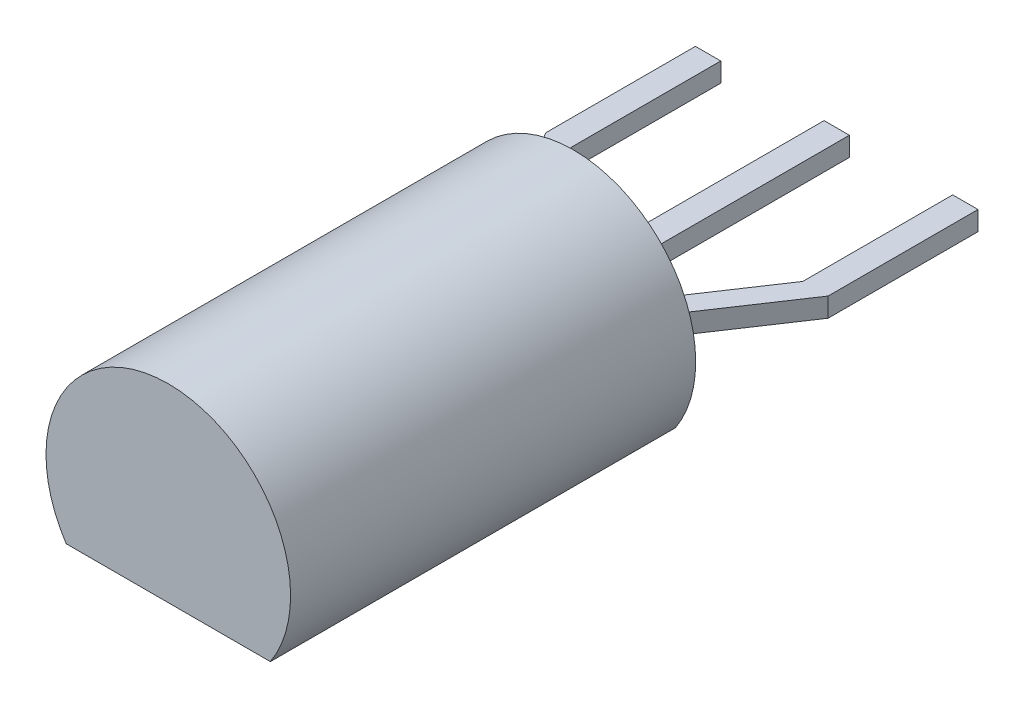
ISO-10303-21;
HEADER;
FILE_DESCRIPTION(('STEP AP214'),'2;1');
FILE_NAME('part.step','',(''),(''),'','','');
FILE_SCHEMA(('AUTOMOTIVE_DESIGN { 1 0 10303 214 1 1 1 1 }'));
ENDSEC;
DATA;
#1=APPLICATION_CONTEXT('core data for automotive mechanical design processes');
#2=APPLICATION_PROTOCOL_DEFINITION('international standard','automotive_design',2000,#1);
#3=PRODUCT_CONTEXT('',#1,'mechanical');
#4=PRODUCT('Part','Part','',(#3));
#5=PRODUCT_RELATED_PRODUCT_CATEGORY('part','',(#4));
#6=PRODUCT_DEFINITION_FORMATION('','',#4);
#7=PRODUCT_DEFINITION_CONTEXT('part definition',#1,'design');
#8=PRODUCT_DEFINITION('design','',#6,#7);
#9=PRODUCT_DEFINITION_SHAPE('','',#8);
#10=(LENGTH_UNIT() NAMED_UNIT(*) SI_UNIT(.MILLI.,.METRE.));
#11=(NAMED_UNIT(*) PLANE_ANGLE_UNIT() SI_UNIT($,.RADIAN.));
#12=(NAMED_UNIT(*) SI_UNIT($,.STERADIAN.) SOLID_ANGLE_UNIT());
#13=UNCERTAINTY_MEASURE_WITH_UNIT(LENGTH_MEASURE(1.E-05),#10,'distance_accuracy_value','');
#14=(GEOMETRIC_REPRESENTATION_CONTEXT(3) GLOBAL_UNCERTAINTY_ASSIGNED_CONTEXT((#13)) GLOBAL_UNIT_ASSIGNED_CONTEXT((#10,
#11,#12)) REPRESENTATION_CONTEXT('',''));
#15=CARTESIAN_POINT('',(0.,0.,0.));
#16=DIRECTION('',(0.,0.,1.));
#17=DIRECTION('',(1.,0.,0.));
#18=AXIS2_PLACEMENT_3D('',#15,#16,#17);
#19=CARTESIAN_POINT('',(0.25,0.19,0.26));
#20=DIRECTION('',(-0.831376502259989,0.,0.555709556773993));
#21=DIRECTION('',(0.,1.,0.));
#22=AXIS2_PLACEMENT_3D('',#19,#20,#21);
#23=PLANE('',#22);
#24=DIRECTION('',(0.555709556773993,0.,0.831376502259989));
#25=VECTOR('',#24,1.);
#26=CARTESIAN_POINT('',(0.25,0.19,0.26));
#27=LINE('',#26,#25);
#28=CARTESIAN_POINT('',(0.25,0.19,0.26));
#29=VERTEX_POINT('',#28);
#30=CARTESIAN_POINT('',(1.52,0.19,2.16));
#31=VERTEX_POINT('',#30);
#32=EDGE_CURVE('E399',#29,#31,#27,.T.);
#33=ORIENTED_EDGE('',*,*,#32,.T.);
#34=DIRECTION('',(0.,-1.,0.));
#35=VECTOR('',#34,1.);
#36=CARTESIAN_POINT('',(1.52,0.19,2.16));
#37=LINE('',#36,#35);
#38=CARTESIAN_POINT('',(1.52,-0.19,2.16));
#39=VERTEX_POINT('',#38);
#40=EDGE_CURVE('E48',#31,#39,#37,.T.);
#41=ORIENTED_EDGE('',*,*,#40,.T.);
#42=DIRECTION('',(0.555709556773993,0.,0.831376502259989));
#43=VECTOR('',#42,1.);
#44=CARTESIAN_POINT('',(0.25,-0.19,0.26));
#45=LINE('',#44,#43);
#46=CARTESIAN_POINT('',(0.25,-0.19,0.26));
#47=VERTEX_POINT('',#46);
#48=EDGE_CURVE('E298',#47,#39,#45,.T.);
#49=ORIENTED_EDGE('',*,*,#48,.F.);
#50=DIRECTION('',(0.,-1.,0.));
#51=VECTOR('',#50,1.);
#52=CARTESIAN_POINT('',(0.25,0.19,0.26));
#53=LINE('',#52,#51);
#54=EDGE_CURVE('E38',#29,#47,#53,.T.);
#55=ORIENTED_EDGE('',*,*,#54,.F.);
#56=EDGE_LOOP('',(#33,#41,#49,#55));
#57=FACE_BOUND('',#56,.T.);
#58=ADVANCED_FACE('F17',(#57),#23,.F.);
#59=CARTESIAN_POINT('',(-0.25,0.19,0.26));
#60=DIRECTION('',(-0.831376502259989,0.,0.555709556773993));
#61=DIRECTION('',(0.,1.,0.));
#62=AXIS2_PLACEMENT_3D('',#59,#60,#61);
#63=PLANE('',#62);
#64=DIRECTION('',(0.,-1.,0.));
#65=VECTOR('',#64,1.);
#66=CARTESIAN_POINT('',(-0.25,0.19,0.26));
#67=LINE('',#66,#65);
#68=CARTESIAN_POINT('',(-0.25,0.19,0.26));
#69=VERTEX_POINT('',#68);
#70=CARTESIAN_POINT('',(-0.25,-0.19,0.26));
#71=VERTEX_POINT('',#70);
#72=EDGE_CURVE('E11',#69,#71,#67,.T.);
#73=ORIENTED_EDGE('',*,*,#72,.T.);
#74=DIRECTION('',(0.555709556773993,0.,0.831376502259989));
#75=VECTOR('',#74,1.);
#76=CARTESIAN_POINT('',(-0.25,-0.19,0.26));
#77=LINE('',#76,#75);
#78=CARTESIAN_POINT('',(1.02,-0.19,2.16));
#79=VERTEX_POINT('',#78);
#80=EDGE_CURVE('E361',#71,#79,#77,.T.);
#81=ORIENTED_EDGE('',*,*,#80,.T.);
#82=DIRECTION('',(0.,-1.,0.));
#83=VECTOR('',#82,1.);
#84=CARTESIAN_POINT('',(1.02,0.19,2.16));
#85=LINE('',#84,#83);
#86=CARTESIAN_POINT('',(1.02,0.19,2.16));
#87=VERTEX_POINT('',#86);
#88=EDGE_CURVE('E285',#87,#79,#85,.T.);
#89=ORIENTED_EDGE('',*,*,#88,.F.);
#90=DIRECTION('',(0.555709556773993,0.,0.831376502259989));
#91=VECTOR('',#90,1.);
#92=CARTESIAN_POINT('',(-0.25,0.19,0.26));
#93=LINE('',#92,#91);
#94=EDGE_CURVE('E263',#69,#87,#93,.T.);
#95=ORIENTED_EDGE('',*,*,#94,.F.);
#96=EDGE_LOOP('',(#73,#81,#89,#95));
#97=FACE_BOUND('',#96,.T.);
#98=ADVANCED_FACE('F441',(#97),#63,.T.);
#99=CARTESIAN_POINT('',(-0.25,0.19,-2.7));
#100=DIRECTION('',(-1.,0.,0.));
#101=DIRECTION('',(0.,0.,1.));
#102=AXIS2_PLACEMENT_3D('',#99,#100,#101);
#103=PLANE('',#102);
#104=DIRECTION('',(0.,-1.,0.));
#105=VECTOR('',#104,1.);
#106=CARTESIAN_POINT('',(-0.25,0.19,-2.7));
#107=LINE('',#106,#105);
#108=CARTESIAN_POINT('',(-0.25,0.19,-2.7));
#109=VERTEX_POINT('',#108);
#110=CARTESIAN_POINT('',(-0.25,-0.19,-2.7));
#111=VERTEX_POINT('',#110);
#112=EDGE_CURVE('E20',#109,#111,#107,.T.);
#113=ORIENTED_EDGE('',*,*,#112,.T.);
#114=DIRECTION('',(0.,0.,1.));
#115=VECTOR('',#114,1.);
#116=CARTESIAN_POINT('',(-0.25,-0.19,-2.7));
#117=LINE('',#116,#115);
#118=EDGE_CURVE('E383',#111,#71,#117,.T.);
#119=ORIENTED_EDGE('',*,*,#118,.T.);
#120=ORIENTED_EDGE('',*,*,#72,.F.);
#121=DIRECTION('',(0.,0.,1.));
#122=VECTOR('',#121,1.);
#123=CARTESIAN_POINT('',(-0.25,0.19,-2.7));
#124=LINE('',#123,#122);
#125=EDGE_CURVE('E259',#109,#69,#124,.T.);
#126=ORIENTED_EDGE('',*,*,#125,.F.);
#127=EDGE_LOOP('',(#113,#119,#120,#126));
#128=FACE_BOUND('',#127,.T.);
#129=ADVANCED_FACE('F429',(#128),#103,.T.);
#130=CARTESIAN_POINT('',(0.25,0.19,-2.7));
#131=DIRECTION('',(0.,0.,-1.));
#132=DIRECTION('',(0.,-1.,0.));
#133=AXIS2_PLACEMENT_3D('',#130,#131,#132);
#134=PLANE('',#133);
#135=DIRECTION('',(0.,-1.,0.));
#136=VECTOR('',#135,1.);
#137=CARTESIAN_POINT('',(0.25,0.19,-2.7));
#138=LINE('',#137,#136);
#139=CARTESIAN_POINT('',(0.25,0.19,-2.7));
#140=VERTEX_POINT('',#139);
#141=CARTESIAN_POINT('',(0.25,-0.19,-2.7));
#142=VERTEX_POINT('',#141);
#143=EDGE_CURVE('E417',#140,#142,#138,.T.);
#144=ORIENTED_EDGE('',*,*,#143,.T.);
#145=DIRECTION('',(-1.,0.,0.));
#146=VECTOR('',#145,1.);
#147=CARTESIAN_POINT('',(0.25,-0.19,-2.7));
#148=LINE('',#147,#146);
#149=EDGE_CURVE('E387',#142,#111,#148,.T.);
#150=ORIENTED_EDGE('',*,*,#149,.T.);
#151=ORIENTED_EDGE('',*,*,#112,.F.);
#152=DIRECTION('',(-1.,0.,0.));
#153=VECTOR('',#152,1.);
#154=CARTESIAN_POINT('',(0.25,0.19,-2.7));
#155=LINE('',#154,#153);
#156=EDGE_CURVE('E264',#140,#109,#155,.T.);
#157=ORIENTED_EDGE('',*,*,#156,.F.);
#158=EDGE_LOOP('',(#144,#150,#151,#157));
#159=FACE_BOUND('',#158,.T.);
#160=ADVANCED_FACE('F432',(#159),#134,.T.);
#161=CARTESIAN_POINT('',(0.25,0.19,0.26));
#162=DIRECTION('',(1.,0.,0.));
#163=DIRECTION('',(0.,1.,0.));
#164=AXIS2_PLACEMENT_3D('',#161,#162,#163);
#165=PLANE('',#164);
#166=ORIENTED_EDGE('',*,*,#54,.T.);
#167=DIRECTION('',(0.,0.,-1.));
#168=VECTOR('',#167,1.);
#169=CARTESIAN_POINT('',(0.25,-0.19,0.26));
#170=LINE('',#169,#168);
#171=EDGE_CURVE('E269',#47,#142,#170,.T.);
#172=ORIENTED_EDGE('',*,*,#171,.T.);
#173=ORIENTED_EDGE('',*,*,#143,.F.);
#174=DIRECTION('',(0.,0.,-1.));
#175=VECTOR('',#174,1.);
#176=CARTESIAN_POINT('',(0.25,0.19,0.26));
#177=LINE('',#176,#175);
#178=EDGE_CURVE('E402',#29,#140,#177,.T.);
#179=ORIENTED_EDGE('',*,*,#178,.F.);
#180=EDGE_LOOP('',(#166,#172,#173,#179));
#181=FACE_BOUND('',#180,.T.);
#182=ADVANCED_FACE('F448',(#181),#165,.T.);
#183=CARTESIAN_POINT('',(3.56,0.19,2.16));
#184=DIRECTION('',(0.831376502259989,0.,0.555709556773993));
#185=DIRECTION('',(0.,-1.,0.));
#186=AXIS2_PLACEMENT_3D('',#183,#184,#185);
#187=PLANE('',#186);
#188=DIRECTION('',(0.555709556773993,0.,-0.831376502259989));
#189=VECTOR('',#188,1.);
#190=CARTESIAN_POINT('',(3.56,0.19,2.16));
#191=LINE('',#190,#189);
#192=CARTESIAN_POINT('',(3.56,0.19,2.16));
#193=VERTEX_POINT('',#192);
#194=CARTESIAN_POINT('',(4.83,0.19,0.26));
#195=VERTEX_POINT('',#194);
#196=EDGE_CURVE('E226',#193,#195,#191,.T.);
#197=ORIENTED_EDGE('',*,*,#196,.T.);
#198=DIRECTION('',(0.,-1.,0.));
#199=VECTOR('',#198,1.);
#200=CARTESIAN_POINT('',(4.83,0.19,0.26));
#201=LINE('',#200,#199);
#202=CARTESIAN_POINT('',(4.83,-0.19,0.26));
#203=VERTEX_POINT('',#202);
#204=EDGE_CURVE('E413',#195,#203,#201,.T.);
#205=ORIENTED_EDGE('',*,*,#204,.T.);
#206=DIRECTION('',(0.555709556773993,0.,-0.831376502259989));
#207=VECTOR('',#206,1.);
#208=CARTESIAN_POINT('',(3.56,-0.19,2.16));
#209=LINE('',#208,#207);
#210=CARTESIAN_POINT('',(3.56,-0.19,2.16));
#211=VERTEX_POINT('',#210);
#212=EDGE_CURVE('E348',#211,#203,#209,.T.);
#213=ORIENTED_EDGE('',*,*,#212,.F.);
#214=DIRECTION('',(0.,-1.,0.));
#215=VECTOR('',#214,1.);
#216=CARTESIAN_POINT('',(3.56,0.19,2.16));
#217=LINE('',#216,#215);
#218=EDGE_CURVE('E230',#193,#211,#217,.T.);
#219=ORIENTED_EDGE('',*,*,#218,.F.);
#220=EDGE_LOOP('',(#197,#205,#213,#219));
#221=FACE_BOUND('',#220,.T.);
#222=ADVANCED_FACE('F685',(#221),#187,.F.);
#223=CARTESIAN_POINT('',(4.83,0.19,-2.7));
#224=DIRECTION('',(-1.,0.,0.));
#225=DIRECTION('',(0.,0.,1.));
#226=AXIS2_PLACEMENT_3D('',#223,#224,#225);
#227=PLANE('',#226);
#228=DIRECTION('',(0.,-1.,0.));
#229=VECTOR('',#228,1.);
#230=CARTESIAN_POINT('',(4.83,0.19,-2.7));
#231=LINE('',#230,#229);
#232=CARTESIAN_POINT('',(4.83,0.19,-2.7));
#233=VERTEX_POINT('',#232);
#234=CARTESIAN_POINT('',(4.83,-0.19,-2.7));
#235=VERTEX_POINT('',#234);
#236=EDGE_CURVE('E410',#233,#235,#231,.T.);
#237=ORIENTED_EDGE('',*,*,#236,.T.);
#238=DIRECTION('',(0.,0.,1.));
#239=VECTOR('',#238,1.);
#240=CARTESIAN_POINT('',(4.83,-0.19,-2.7));
#241=LINE('',#240,#239);
#242=EDGE_CURVE('E352',#235,#203,#241,.T.);
#243=ORIENTED_EDGE('',*,*,#242,.T.);
#244=ORIENTED_EDGE('',*,*,#204,.F.);
#245=DIRECTION('',(0.,0.,1.));
#246=VECTOR('',#245,1.);
#247=CARTESIAN_POINT('',(4.83,0.19,-2.7));
#248=LINE('',#247,#246);
#249=EDGE_CURVE('E367',#233,#195,#248,.T.);
#250=ORIENTED_EDGE('',*,*,#249,.F.);
#251=EDGE_LOOP('',(#237,#243,#244,#250));
#252=FACE_BOUND('',#251,.T.);
#253=ADVANCED_FACE('F696',(#252),#227,.T.);
#254=CARTESIAN_POINT('',(5.33,0.19,-2.7));
#255=DIRECTION('',(0.,0.,-1.));
#256=DIRECTION('',(0.,-1.,0.));
#257=AXIS2_PLACEMENT_3D('',#254,#255,#256);
#258=PLANE('',#257);
#259=DIRECTION('',(0.,-1.,0.));
#260=VECTOR('',#259,1.);
#261=CARTESIAN_POINT('',(5.33,0.19,-2.7));
#262=LINE('',#261,#260);
#263=CARTESIAN_POINT('',(5.33,0.19,-2.7));
#264=VERTEX_POINT('',#263);
#265=CARTESIAN_POINT('',(5.33,-0.19,-2.7));
#266=VERTEX_POINT('',#265);
#267=EDGE_CURVE('E345',#264,#266,#262,.T.);
#268=ORIENTED_EDGE('',*,*,#267,.T.);
#269=DIRECTION('',(-1.,0.,0.));
#270=VECTOR('',#269,1.);
#271=CARTESIAN_POINT('',(5.33,-0.19,-2.7));
#272=LINE('',#271,#270);
#273=EDGE_CURVE('E231',#266,#235,#272,.T.);
#274=ORIENTED_EDGE('',*,*,#273,.T.);
#275=ORIENTED_EDGE('',*,*,#236,.F.);
#276=DIRECTION('',(-1.,0.,0.));
#277=VECTOR('',#276,1.);
#278=CARTESIAN_POINT('',(5.33,0.19,-2.7));
#279=LINE('',#278,#277);
#280=EDGE_CURVE('E364',#264,#233,#279,.T.);
#281=ORIENTED_EDGE('',*,*,#280,.F.);
#282=EDGE_LOOP('',(#268,#274,#275,#281));
#283=FACE_BOUND('',#282,.T.);
#284=ADVANCED_FACE('F673',(#283),#258,.T.);
#285=CARTESIAN_POINT('',(5.33,0.19,0.26));
#286=DIRECTION('',(1.,0.,0.));
#287=DIRECTION('',(0.,1.,0.));
#288=AXIS2_PLACEMENT_3D('',#285,#286,#287);
#289=PLANE('',#288);
#290=DIRECTION('',(0.,-1.,0.));
#291=VECTOR('',#290,1.);
#292=CARTESIAN_POINT('',(5.33,0.19,0.26));
#293=LINE('',#292,#291);
#294=CARTESIAN_POINT('',(5.33,0.19,0.26));
#295=VERTEX_POINT('',#294);
#296=CARTESIAN_POINT('',(5.33,-0.19,0.26));
#297=VERTEX_POINT('',#296);
#298=EDGE_CURVE('E342',#295,#297,#293,.T.);
#299=ORIENTED_EDGE('',*,*,#298,.T.);
#300=DIRECTION('',(0.,0.,-1.));
#301=VECTOR('',#300,1.);
#302=CARTESIAN_POINT('',(5.33,-0.19,0.26));
#303=LINE('',#302,#301);
#304=EDGE_CURVE('E335',#297,#266,#303,.T.);
#305=ORIENTED_EDGE('',*,*,#304,.T.);
#306=ORIENTED_EDGE('',*,*,#267,.F.);
#307=DIRECTION('',(0.,0.,-1.));
#308=VECTOR('',#307,1.);
#309=CARTESIAN_POINT('',(5.33,0.19,0.26));
#310=LINE('',#309,#308);
#311=EDGE_CURVE('E265',#295,#264,#310,.T.);
#312=ORIENTED_EDGE('',*,*,#311,.F.);
#313=EDGE_LOOP('',(#299,#305,#306,#312));
#314=FACE_BOUND('',#313,.T.);
#315=ADVANCED_FACE('F662',(#314),#289,.T.);
#316=CARTESIAN_POINT('',(5.33,0.19,0.26));
#317=DIRECTION('',(-0.831376502259989,0.,-0.555709556773993));
#318=DIRECTION('',(-0.555709556773993,0.,0.831376502259989));
#319=AXIS2_PLACEMENT_3D('',#316,#317,#318);
#320=PLANE('',#319);
#321=DIRECTION('',(-0.555709556773993,0.,0.831376502259989));
#322=VECTOR('',#321,1.);
#323=CARTESIAN_POINT('',(5.33,0.19,0.26));
#324=LINE('',#323,#322);
#325=CARTESIAN_POINT('',(4.06,0.19,2.16));
#326=VERTEX_POINT('',#325);
#327=EDGE_CURVE('E270',#295,#326,#324,.T.);
#328=ORIENTED_EDGE('',*,*,#327,.T.);
#329=DIRECTION('',(0.,-1.,0.));
#330=VECTOR('',#329,1.);
#331=CARTESIAN_POINT('',(4.06,0.19,2.16));
#332=LINE('',#331,#330);
#333=CARTESIAN_POINT('',(4.06,-0.19,2.16));
#334=VERTEX_POINT('',#333);
#335=EDGE_CURVE('E331',#326,#334,#332,.T.);
#336=ORIENTED_EDGE('',*,*,#335,.T.);
#337=DIRECTION('',(-0.555709556773993,0.,0.831376502259989));
#338=VECTOR('',#337,1.);
#339=CARTESIAN_POINT('',(5.33,-0.19,0.26));
#340=LINE('',#339,#338);
#341=EDGE_CURVE('E339',#297,#334,#340,.T.);
#342=ORIENTED_EDGE('',*,*,#341,.F.);
#343=ORIENTED_EDGE('',*,*,#298,.F.);
#344=EDGE_LOOP('',(#328,#336,#342,#343));
#345=FACE_BOUND('',#344,.T.);
#346=ADVANCED_FACE('F651',(#345),#320,.F.);
#347=CARTESIAN_POINT('',(2.79,0.19,-2.7));
#348=DIRECTION('',(0.,0.,-1.));
#349=DIRECTION('',(0.,-1.,0.));
#350=AXIS2_PLACEMENT_3D('',#347,#348,#349);
#351=PLANE('',#350);
#352=DIRECTION('',(0.,-1.,0.));
#353=VECTOR('',#352,1.);
#354=CARTESIAN_POINT('',(2.79,0.19,-2.7));
#355=LINE('',#354,#353);
#356=CARTESIAN_POINT('',(2.79,0.19,-2.7));
#357=VERTEX_POINT('',#356);
#358=CARTESIAN_POINT('',(2.79,-0.19,-2.7));
#359=VERTEX_POINT('',#358);
#360=EDGE_CURVE('E306',#357,#359,#355,.T.);
#361=ORIENTED_EDGE('',*,*,#360,.T.);
#362=DIRECTION('',(-1.,0.,0.));
#363=VECTOR('',#362,1.);
#364=CARTESIAN_POINT('',(2.79,-0.19,-2.7));
#365=LINE('',#364,#363);
#366=CARTESIAN_POINT('',(2.29,-0.19,-2.7));
#367=VERTEX_POINT('',#366);
#368=EDGE_CURVE('E313',#359,#367,#365,.T.);
#369=ORIENTED_EDGE('',*,*,#368,.T.);
#370=DIRECTION('',(0.,-1.,0.));
#371=VECTOR('',#370,1.);
#372=CARTESIAN_POINT('',(2.29,0.19,-2.7));
#373=LINE('',#372,#371);
#374=CARTESIAN_POINT('',(2.29,0.19,-2.7));
#375=VERTEX_POINT('',#374);
#376=EDGE_CURVE('E320',#375,#367,#373,.T.);
#377=ORIENTED_EDGE('',*,*,#376,.F.);
#378=DIRECTION('',(-1.,0.,0.));
#379=VECTOR('',#378,1.);
#380=CARTESIAN_POINT('',(2.79,0.19,-2.7));
#381=LINE('',#380,#379);
#382=EDGE_CURVE('E323',#357,#375,#381,.T.);
#383=ORIENTED_EDGE('',*,*,#382,.F.);
#384=EDGE_LOOP('',(#361,#369,#377,#383));
#385=FACE_BOUND('',#384,.T.);
#386=ADVANCED_FACE('F641',(#385),#351,.T.);
#387=CARTESIAN_POINT('',(1.52,0.19,2.8));
#388=DIRECTION('',(1.,0.,0.));
#389=DIRECTION('',(0.,1.,0.));
#390=AXIS2_PLACEMENT_3D('',#387,#388,#389);
#391=PLANE('',#390);
#392=DIRECTION('',(0.,0.,-1.));
#393=VECTOR('',#392,1.);
#394=CARTESIAN_POINT('',(1.52,0.19,2.8));
#395=LINE('',#394,#393);
#396=CARTESIAN_POINT('',(1.52,0.19,2.5));
#397=VERTEX_POINT('',#396);
#398=EDGE_CURVE('E395',#397,#31,#395,.T.);
#399=ORIENTED_EDGE('',*,*,#398,.F.);
#400=DIRECTION('',(0.,-1.,0.));
#401=VECTOR('',#400,1.);
#402=CARTESIAN_POINT('',(1.52,-0.57,2.5));
#403=LINE('',#402,#401);
#404=CARTESIAN_POINT('',(1.52,-0.19,2.5));
#405=VERTEX_POINT('',#404);
#406=EDGE_CURVE('E277',#397,#405,#403,.T.);
#407=ORIENTED_EDGE('',*,*,#406,.T.);
#408=DIRECTION('',(0.,0.,-1.));
#409=VECTOR('',#408,1.);
#410=CARTESIAN_POINT('',(1.52,-0.19,2.8));
#411=LINE('',#410,#409);
#412=EDGE_CURVE('E294',#405,#39,#411,.T.);
#413=ORIENTED_EDGE('',*,*,#412,.T.);
#414=ORIENTED_EDGE('',*,*,#40,.F.);
#415=EDGE_LOOP('',(#399,#407,#413,#414));
#416=FACE_BOUND('',#415,.T.);
#417=ADVANCED_FACE('F449',(#416),#391,.T.);
#418=CARTESIAN_POINT('',(0.25,0.19,0.26));
#419=DIRECTION('',(0.,-1.,0.));
#420=DIRECTION('',(-1.,0.,0.));
#421=AXIS2_PLACEMENT_3D('',#418,#419,#420);
#422=PLANE('',#421);
#423=ORIENTED_EDGE('',*,*,#156,.T.);
#424=ORIENTED_EDGE('',*,*,#125,.T.);
#425=ORIENTED_EDGE('',*,*,#94,.T.);
#426=DIRECTION('',(0.,0.,1.));
#427=VECTOR('',#426,1.);
#428=CARTESIAN_POINT('',(1.02,0.19,2.16));
#429=LINE('',#428,#427);
#430=CARTESIAN_POINT('',(1.02,0.19,2.5));
#431=VERTEX_POINT('',#430);
#432=EDGE_CURVE('E388',#87,#431,#429,.T.);
#433=ORIENTED_EDGE('',*,*,#432,.T.);
#434=DIRECTION('',(-1.,0.,0.));
#435=VECTOR('',#434,1.);
#436=CARTESIAN_POINT('',(0.387115458001,0.19,2.5));
#437=LINE('',#436,#435);
#438=EDGE_CURVE('E281',#397,#431,#437,.T.);
#439=ORIENTED_EDGE('',*,*,#438,.F.);
#440=ORIENTED_EDGE('',*,*,#398,.T.);
#441=ORIENTED_EDGE('',*,*,#32,.F.);
#442=ORIENTED_EDGE('',*,*,#178,.T.);
#443=EDGE_LOOP('',(#423,#424,#425,#433,#439,#440,#441,#442));
#444=FACE_BOUND('',#443,.T.);
#445=ADVANCED_FACE('F445',(#444),#422,.F.);
#446=CARTESIAN_POINT('',(1.02,0.19,2.16));
#447=DIRECTION('',(-1.,0.,0.));
#448=DIRECTION('',(0.,0.,1.));
#449=AXIS2_PLACEMENT_3D('',#446,#447,#448);
#450=PLANE('',#449);
#451=ORIENTED_EDGE('',*,*,#432,.F.);
#452=ORIENTED_EDGE('',*,*,#88,.T.);
#453=DIRECTION('',(0.,0.,1.));
#454=VECTOR('',#453,1.);
#455=CARTESIAN_POINT('',(1.02,-0.19,2.16));
#456=LINE('',#455,#454);
#457=CARTESIAN_POINT('',(1.02,-0.19,2.5));
#458=VERTEX_POINT('',#457);
#459=EDGE_CURVE('E297',#79,#458,#456,.T.);
#460=ORIENTED_EDGE('',*,*,#459,.T.);
#461=DIRECTION('',(0.,1.,0.));
#462=VECTOR('',#461,1.);
#463=CARTESIAN_POINT('',(1.02,-0.57,2.5));
#464=LINE('',#463,#462);
#465=EDGE_CURVE('E289',#458,#431,#464,.T.);
#466=ORIENTED_EDGE('',*,*,#465,.T.);
#467=EDGE_LOOP('',(#451,#452,#460,#466));
#468=FACE_BOUND('',#467,.T.);
#469=ADVANCED_FACE('F456',(#468),#450,.T.);
#470=CARTESIAN_POINT('',(0.25,-0.19,0.26));
#471=DIRECTION('',(0.,-1.,0.));
#472=DIRECTION('',(-1.,0.,0.));
#473=AXIS2_PLACEMENT_3D('',#470,#471,#472);
#474=PLANE('',#473);
#475=ORIENTED_EDGE('',*,*,#171,.F.);
#476=ORIENTED_EDGE('',*,*,#48,.T.);
#477=ORIENTED_EDGE('',*,*,#412,.F.);
#478=DIRECTION('',(-1.,0.,0.));
#479=VECTOR('',#478,1.);
#480=CARTESIAN_POINT('',(0.387115458001,-0.19,2.5));
#481=LINE('',#480,#479);
#482=EDGE_CURVE('E273',#405,#458,#481,.T.);
#483=ORIENTED_EDGE('',*,*,#482,.T.);
#484=ORIENTED_EDGE('',*,*,#459,.F.);
#485=ORIENTED_EDGE('',*,*,#80,.F.);
#486=ORIENTED_EDGE('',*,*,#118,.F.);
#487=ORIENTED_EDGE('',*,*,#149,.F.);
#488=EDGE_LOOP('',(#475,#476,#477,#483,#484,#485,#486,#487));
#489=FACE_BOUND('',#488,.T.);
#490=ADVANCED_FACE('F437',(#489),#474,.T.);
#491=CARTESIAN_POINT('',(5.33,0.19,0.26));
#492=DIRECTION('',(0.,-1.,0.));
#493=DIRECTION('',(-1.,0.,0.));
#494=AXIS2_PLACEMENT_3D('',#491,#492,#493);
#495=PLANE('',#494);
#496=ORIENTED_EDGE('',*,*,#280,.T.);
#497=ORIENTED_EDGE('',*,*,#249,.T.);
#498=ORIENTED_EDGE('',*,*,#196,.F.);
#499=DIRECTION('',(0.,0.,1.));
#500=VECTOR('',#499,1.);
#501=CARTESIAN_POINT('',(3.56,0.19,2.16));
#502=LINE('',#501,#500);
#503=CARTESIAN_POINT('',(3.56,0.19,2.5));
#504=VERTEX_POINT('',#503);
#505=EDGE_CURVE('E216',#193,#504,#502,.T.);
#506=ORIENTED_EDGE('',*,*,#505,.T.);
#507=DIRECTION('',(-1.,0.,0.));
#508=VECTOR('',#507,1.);
#509=CARTESIAN_POINT('',(2.927115458001,0.19,2.5));
#510=LINE('',#509,#508);
#511=CARTESIAN_POINT('',(4.06,0.19,2.5));
#512=VERTEX_POINT('',#511);
#513=EDGE_CURVE('E222',#512,#504,#510,.T.);
#514=ORIENTED_EDGE('',*,*,#513,.F.);
#515=DIRECTION('',(0.,0.,-1.));
#516=VECTOR('',#515,1.);
#517=CARTESIAN_POINT('',(4.06,0.19,2.8));
#518=LINE('',#517,#516);
#519=EDGE_CURVE('E324',#512,#326,#518,.T.);
#520=ORIENTED_EDGE('',*,*,#519,.T.);
#521=ORIENTED_EDGE('',*,*,#327,.F.);
#522=ORIENTED_EDGE('',*,*,#311,.T.);
#523=EDGE_LOOP('',(#496,#497,#498,#506,#514,#520,#521,#522));
#524=FACE_BOUND('',#523,.T.);
#525=ADVANCED_FACE('F219',(#524),#495,.F.);
#526=CARTESIAN_POINT('',(3.56,0.19,2.16));
#527=DIRECTION('',(-1.,0.,0.));
#528=DIRECTION('',(0.,0.,1.));
#529=AXIS2_PLACEMENT_3D('',#526,#527,#528);
#530=PLANE('',#529);
#531=ORIENTED_EDGE('',*,*,#505,.F.);
#532=ORIENTED_EDGE('',*,*,#218,.T.);
#533=DIRECTION('',(0.,0.,1.));
#534=VECTOR('',#533,1.);
#535=CARTESIAN_POINT('',(3.56,-0.19,2.16));
#536=LINE('',#535,#534);
#537=CARTESIAN_POINT('',(3.56,-0.19,2.5));
#538=VERTEX_POINT('',#537);
#539=EDGE_CURVE('E237',#211,#538,#536,.T.);
#540=ORIENTED_EDGE('',*,*,#539,.T.);
#541=DIRECTION('',(0.,1.,0.));
#542=VECTOR('',#541,1.);
#543=CARTESIAN_POINT('',(3.56,-0.57,2.5));
#544=LINE('',#543,#542);
#545=EDGE_CURVE('E234',#538,#504,#544,.T.);
#546=ORIENTED_EDGE('',*,*,#545,.T.);
#547=EDGE_LOOP('',(#531,#532,#540,#546));
#548=FACE_BOUND('',#547,.T.);
#549=ADVANCED_FACE('F235',(#548),#530,.T.);
#550=CARTESIAN_POINT('',(5.33,-0.19,0.26));
#551=DIRECTION('',(0.,-1.,0.));
#552=DIRECTION('',(-1.,0.,0.));
#553=AXIS2_PLACEMENT_3D('',#550,#551,#552);
#554=PLANE('',#553);
#555=ORIENTED_EDGE('',*,*,#304,.F.);
#556=ORIENTED_EDGE('',*,*,#341,.T.);
#557=DIRECTION('',(0.,0.,-1.));
#558=VECTOR('',#557,1.);
#559=CARTESIAN_POINT('',(4.06,-0.19,2.8));
#560=LINE('',#559,#558);
#561=CARTESIAN_POINT('',(4.06,-0.19,2.5));
#562=VERTEX_POINT('',#561);
#563=EDGE_CURVE('E327',#562,#334,#560,.T.);
#564=ORIENTED_EDGE('',*,*,#563,.F.);
#565=DIRECTION('',(-1.,0.,0.));
#566=VECTOR('',#565,1.);
#567=CARTESIAN_POINT('',(2.927115458001,-0.19,2.5));
#568=LINE('',#567,#566);
#569=EDGE_CURVE('E242',#562,#538,#568,.T.);
#570=ORIENTED_EDGE('',*,*,#569,.T.);
#571=ORIENTED_EDGE('',*,*,#539,.F.);
#572=ORIENTED_EDGE('',*,*,#212,.T.);
#573=ORIENTED_EDGE('',*,*,#242,.F.);
#574=ORIENTED_EDGE('',*,*,#273,.F.);
#575=EDGE_LOOP('',(#555,#556,#564,#570,#571,#572,#573,#574));
#576=FACE_BOUND('',#575,.T.);
#577=ADVANCED_FACE('F477',(#576),#554,.T.);
#578=CARTESIAN_POINT('',(4.06,0.19,2.8));
#579=DIRECTION('',(1.,0.,0.));
#580=DIRECTION('',(0.,1.,0.));
#581=AXIS2_PLACEMENT_3D('',#578,#579,#580);
#582=PLANE('',#581);
#583=ORIENTED_EDGE('',*,*,#519,.F.);
#584=DIRECTION('',(0.,-1.,0.));
#585=VECTOR('',#584,1.);
#586=CARTESIAN_POINT('',(4.06,-0.57,2.5));
#587=LINE('',#586,#585);
#588=EDGE_CURVE('E247',#512,#562,#587,.T.);
#589=ORIENTED_EDGE('',*,*,#588,.T.);
#590=ORIENTED_EDGE('',*,*,#563,.T.);
#591=ORIENTED_EDGE('',*,*,#335,.F.);
#592=EDGE_LOOP('',(#583,#589,#590,#591));
#593=FACE_BOUND('',#592,.T.);
#594=ADVANCED_FACE('F489',(#593),#582,.T.);
#595=CARTESIAN_POINT('',(2.29,0.19,2.8));
#596=DIRECTION('',(0.,-1.,0.));
#597=DIRECTION('',(-1.,0.,0.));
#598=AXIS2_PLACEMENT_3D('',#595,#596,#597);
#599=PLANE('',#598);
#600=DIRECTION('',(0.,0.,-1.));
#601=VECTOR('',#600,1.);
#602=CARTESIAN_POINT('',(2.79,0.19,2.8));
#603=LINE('',#602,#601);
#604=CARTESIAN_POINT('',(2.79,0.19,2.5));
#605=VERTEX_POINT('',#604);
#606=EDGE_CURVE('E293',#605,#357,#603,.T.);
#607=ORIENTED_EDGE('',*,*,#606,.T.);
#608=ORIENTED_EDGE('',*,*,#382,.T.);
#609=DIRECTION('',(0.,0.,1.));
#610=VECTOR('',#609,1.);
#611=CARTESIAN_POINT('',(2.29,0.19,-2.7));
#612=LINE('',#611,#610);
#613=CARTESIAN_POINT('',(2.29,0.19,2.5));
#614=VERTEX_POINT('',#613);
#615=EDGE_CURVE('E316',#375,#614,#612,.T.);
#616=ORIENTED_EDGE('',*,*,#615,.T.);
#617=DIRECTION('',(-1.,0.,0.));
#618=VECTOR('',#617,1.);
#619=CARTESIAN_POINT('',(1.407115458001,0.19,2.5));
#620=LINE('',#619,#618);
#621=EDGE_CURVE('E803',#605,#614,#620,.T.);
#622=ORIENTED_EDGE('',*,*,#621,.F.);
#623=EDGE_LOOP('',(#607,#608,#616,#622));
#624=FACE_BOUND('',#623,.T.);
#625=ADVANCED_FACE('F492',(#624),#599,.F.);
#626=CARTESIAN_POINT('',(2.29,0.19,-2.7));
#627=DIRECTION('',(-1.,0.,0.));
#628=DIRECTION('',(0.,0.,1.));
#629=AXIS2_PLACEMENT_3D('',#626,#627,#628);
#630=PLANE('',#629);
#631=ORIENTED_EDGE('',*,*,#615,.F.);
#632=ORIENTED_EDGE('',*,*,#376,.T.);
#633=DIRECTION('',(0.,0.,1.));
#634=VECTOR('',#633,1.);
#635=CARTESIAN_POINT('',(2.29,-0.19,-2.7));
#636=LINE('',#635,#634);
#637=CARTESIAN_POINT('',(2.29,-0.19,2.5));
#638=VERTEX_POINT('',#637);
#639=EDGE_CURVE('E310',#367,#638,#636,.T.);
#640=ORIENTED_EDGE('',*,*,#639,.T.);
#641=DIRECTION('',(0.,1.,0.));
#642=VECTOR('',#641,1.);
#643=CARTESIAN_POINT('',(2.29,-0.57,2.5));
#644=LINE('',#643,#642);
#645=EDGE_CURVE('E796',#638,#614,#644,.T.);
#646=ORIENTED_EDGE('',*,*,#645,.T.);
#647=EDGE_LOOP('',(#631,#632,#640,#646));
#648=FACE_BOUND('',#647,.T.);
#649=ADVANCED_FACE('F500',(#648),#630,.T.);
#650=CARTESIAN_POINT('',(2.29,-0.19,2.8));
#651=DIRECTION('',(0.,-1.,0.));
#652=DIRECTION('',(-1.,0.,0.));
#653=AXIS2_PLACEMENT_3D('',#650,#651,#652);
#654=PLANE('',#653);
#655=DIRECTION('',(-1.,0.,0.));
#656=VECTOR('',#655,1.);
#657=CARTESIAN_POINT('',(1.407115458001,-0.19,2.5));
#658=LINE('',#657,#656);
#659=CARTESIAN_POINT('',(2.79,-0.19,2.5));
#660=VERTEX_POINT('',#659);
#661=EDGE_CURVE('E253',#660,#638,#658,.T.);
#662=ORIENTED_EDGE('',*,*,#661,.T.);
#663=ORIENTED_EDGE('',*,*,#639,.F.);
#664=ORIENTED_EDGE('',*,*,#368,.F.);
#665=DIRECTION('',(0.,0.,-1.));
#666=VECTOR('',#665,1.);
#667=CARTESIAN_POINT('',(2.79,-0.19,2.8));
#668=LINE('',#667,#666);
#669=EDGE_CURVE('E302',#660,#359,#668,.T.);
#670=ORIENTED_EDGE('',*,*,#669,.F.);
#671=EDGE_LOOP('',(#662,#663,#664,#670));
#672=FACE_BOUND('',#671,.T.);
#673=ADVANCED_FACE('F504',(#672),#654,.T.);
#674=CARTESIAN_POINT('',(2.79,0.19,2.8));
#675=DIRECTION('',(1.,0.,0.));
#676=DIRECTION('',(0.,1.,0.));
#677=AXIS2_PLACEMENT_3D('',#674,#675,#676);
#678=PLANE('',#677);
#679=ORIENTED_EDGE('',*,*,#606,.F.);
#680=DIRECTION('',(0.,-1.,0.));
#681=VECTOR('',#680,1.);
#682=CARTESIAN_POINT('',(2.79,-0.57,2.5));
#683=LINE('',#682,#681);
#684=EDGE_CURVE('E256',#605,#660,#683,.T.);
#685=ORIENTED_EDGE('',*,*,#684,.T.);
#686=ORIENTED_EDGE('',*,*,#669,.T.);
#687=ORIENTED_EDGE('',*,*,#360,.F.);
#688=EDGE_LOOP('',(#679,#685,#686,#687));
#689=FACE_BOUND('',#688,.T.);
#690=ADVANCED_FACE('F496',(#689),#678,.T.);
#691=CARTESIAN_POINT('',(0.524230916003,-1.33,10.5));
#692=DIRECTION('',(0.,0.,-1.));
#693=DIRECTION('',(0.,-1.,0.));
#694=AXIS2_PLACEMENT_3D('',#691,#692,#693);
#695=PLANE('',#694);
#696=DIRECTION('',(1.,0.,0.));
#697=VECTOR('',#696,1.);
#698=CARTESIAN_POINT('',(0.524230916003,-1.33,10.5));
#699=LINE('',#698,#697);
#700=CARTESIAN_POINT('',(0.524230916003,-1.33,10.5));
#701=VERTEX_POINT('',#700);
#702=CARTESIAN_POINT('',(4.555769083998,-1.33,10.5));
#703=VERTEX_POINT('',#702);
#704=EDGE_CURVE('E814',#701,#703,#699,.T.);
#705=ORIENTED_EDGE('',*,*,#704,.T.);
#706=CARTESIAN_POINT('',(2.54,0.,10.5));
#707=DIRECTION('',(0.,0.,1.));
#708=DIRECTION('',(1.,0.,0.));
#709=AXIS2_PLACEMENT_3D('',#706,#707,#708);
#710=CIRCLE('',#709,2.415);
#711=EDGE_CURVE('E826',#703,#701,#710,.T.);
#712=ORIENTED_EDGE('',*,*,#711,.T.);
#713=EDGE_LOOP('',(#705,#712));
#714=FACE_BOUND('',#713,.T.);
#715=ADVANCED_FACE('F487',(#714),#695,.F.);
#716=CARTESIAN_POINT('',(0.524230916003,-1.33,2.5));
#717=DIRECTION('',(0.,0.,-1.));
#718=DIRECTION('',(0.,-1.,0.));
#719=AXIS2_PLACEMENT_3D('',#716,#717,#718);
#720=PLANE('',#719);
#721=ORIENTED_EDGE('',*,*,#482,.F.);
#722=ORIENTED_EDGE('',*,*,#406,.F.);
#723=ORIENTED_EDGE('',*,*,#438,.T.);
#724=ORIENTED_EDGE('',*,*,#465,.F.);
#725=EDGE_LOOP('',(#721,#722,#723,#724));
#726=FACE_BOUND('',#725,.T.);
#727=ORIENTED_EDGE('',*,*,#588,.F.);
#728=ORIENTED_EDGE('',*,*,#513,.T.);
#729=ORIENTED_EDGE('',*,*,#545,.F.);
#730=ORIENTED_EDGE('',*,*,#569,.F.);
#731=EDGE_LOOP('',(#727,#728,#729,#730));
#732=FACE_BOUND('',#731,.T.);
#733=ORIENTED_EDGE('',*,*,#684,.F.);
#734=ORIENTED_EDGE('',*,*,#621,.T.);
#735=ORIENTED_EDGE('',*,*,#645,.F.);
#736=ORIENTED_EDGE('',*,*,#661,.F.);
#737=EDGE_LOOP('',(#733,#734,#735,#736));
#738=FACE_BOUND('',#737,.T.);
#739=DIRECTION('',(1.,0.,0.));
#740=VECTOR('',#739,1.);
#741=CARTESIAN_POINT('',(0.524230916003,-1.33,2.5));
#742=LINE('',#741,#740);
#743=CARTESIAN_POINT('',(0.524230916003,-1.33,2.5));
#744=VERTEX_POINT('',#743);
#745=CARTESIAN_POINT('',(4.555769083998,-1.33,2.5));
#746=VERTEX_POINT('',#745);
#747=EDGE_CURVE('E807',#744,#746,#742,.T.);
#748=ORIENTED_EDGE('',*,*,#747,.F.);
#749=CARTESIAN_POINT('',(2.54,0.,2.5));
#750=DIRECTION('',(0.,0.,1.));
#751=DIRECTION('',(1.,0.,0.));
#752=AXIS2_PLACEMENT_3D('',#749,#750,#751);
#753=CIRCLE('',#752,2.415);
#754=EDGE_CURVE('E824',#746,#744,#753,.T.);
#755=ORIENTED_EDGE('',*,*,#754,.F.);
#756=EDGE_LOOP('',(#748,#755));
#757=FACE_BOUND('',#756,.T.);
#758=ADVANCED_FACE('F244',(#726,#732,#738,#757),#720,.T.);
#759=CARTESIAN_POINT('',(2.54,0.,2.5));
#760=DIRECTION('',(0.,0.,-1.));
#761=DIRECTION('',(1.,0.,0.));
#762=AXIS2_PLACEMENT_3D('',#759,#760,#761);
#763=CYLINDRICAL_SURFACE('',#762,2.415);
#764=ORIENTED_EDGE('',*,*,#754,.T.);
#765=DIRECTION('',(0.,0.,1.));
#766=VECTOR('',#765,1.);
#767=CARTESIAN_POINT('',(0.524230916003,-1.33,2.5));
#768=LINE('',#767,#766);
#769=EDGE_CURVE('E818',#744,#701,#768,.T.);
#770=ORIENTED_EDGE('',*,*,#769,.T.);
#771=ORIENTED_EDGE('',*,*,#711,.F.);
#772=DIRECTION('',(0.,0.,1.));
#773=VECTOR('',#772,1.);
#774=CARTESIAN_POINT('',(4.555769083998,-1.33,2.5));
#775=LINE('',#774,#773);
#776=EDGE_CURVE('E810',#746,#703,#775,.T.);
#777=ORIENTED_EDGE('',*,*,#776,.F.);
#778=EDGE_LOOP('',(#764,#770,#771,#777));
#779=FACE_BOUND('',#778,.T.);
#780=ADVANCED_FACE('F479',(#779),#763,.T.);
#781=CARTESIAN_POINT('',(0.524230916003,-1.33,2.5));
#782=DIRECTION('',(0.,1.,0.));
#783=DIRECTION('',(1.,0.,0.));
#784=AXIS2_PLACEMENT_3D('',#781,#782,#783);
#785=PLANE('',#784);
#786=ORIENTED_EDGE('',*,*,#747,.T.);
#787=ORIENTED_EDGE('',*,*,#776,.T.);
#788=ORIENTED_EDGE('',*,*,#704,.F.);
#789=ORIENTED_EDGE('',*,*,#769,.F.);
#790=EDGE_LOOP('',(#786,#787,#788,#789));
#791=FACE_BOUND('',#790,.T.);
#792=ADVANCED_FACE('F482',(#791),#785,.F.);
#793=CLOSED_SHELL('',(#58,#98,#129,#160,#182,#222,#253,#284,#315,#346,#386,#417,#445,#469,#490,
#525,#549,#577,#594,#625,#649,#673,#690,#715,#758,#780,#792));
#794=MANIFOLD_SOLID_BREP('B1',#793);
#795=ADVANCED_BREP_SHAPE_REPRESENTATION('',(#18,#794),#14);
#796=SHAPE_DEFINITION_REPRESENTATION(#9,#795);
ENDSEC;
END-ISO-10303-21;
